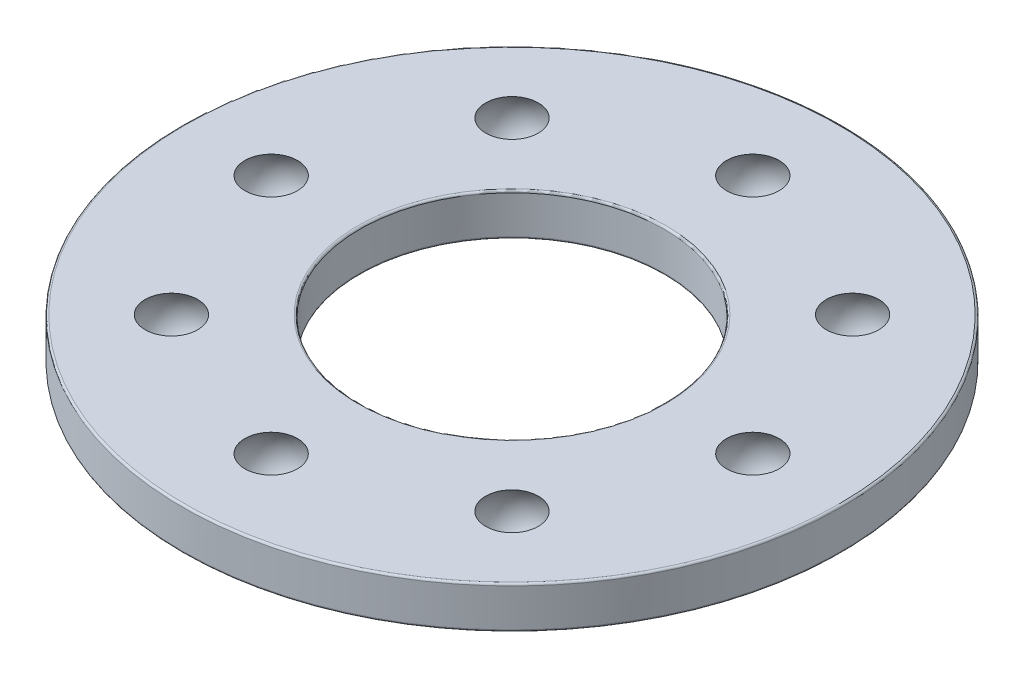
ISO-10303-21;
HEADER;
FILE_DESCRIPTION(('STEP AP214'),'2;1');
FILE_NAME('part.step','',(''),(''),'','','');
FILE_SCHEMA(('AUTOMOTIVE_DESIGN { 1 0 10303 214 1 1 1 1 }'));
ENDSEC;
DATA;
#1=APPLICATION_CONTEXT('core data for automotive mechanical design processes');
#2=APPLICATION_PROTOCOL_DEFINITION('international standard','automotive_design',2000,#1);
#3=PRODUCT_CONTEXT('',#1,'mechanical');
#4=PRODUCT('Part','Part','',(#3));
#5=PRODUCT_RELATED_PRODUCT_CATEGORY('part','',(#4));
#6=PRODUCT_DEFINITION_FORMATION('','',#4);
#7=PRODUCT_DEFINITION_CONTEXT('part definition',#1,'design');
#8=PRODUCT_DEFINITION('design','',#6,#7);
#9=PRODUCT_DEFINITION_SHAPE('','',#8);
#10=(LENGTH_UNIT() NAMED_UNIT(*) SI_UNIT(.MILLI.,.METRE.));
#11=(NAMED_UNIT(*) PLANE_ANGLE_UNIT() SI_UNIT($,.RADIAN.));
#12=(NAMED_UNIT(*) SI_UNIT($,.STERADIAN.) SOLID_ANGLE_UNIT());
#13=UNCERTAINTY_MEASURE_WITH_UNIT(LENGTH_MEASURE(1.E-05),#10,'distance_accuracy_value','');
#14=(GEOMETRIC_REPRESENTATION_CONTEXT(3) GLOBAL_UNCERTAINTY_ASSIGNED_CONTEXT((#13)) GLOBAL_UNIT_ASSIGNED_CONTEXT((#10,
#11,#12)) REPRESENTATION_CONTEXT('',''));
#15=CARTESIAN_POINT('',(0.,0.,0.));
#16=DIRECTION('',(0.,0.,1.));
#17=DIRECTION('',(1.,0.,0.));
#18=AXIS2_PLACEMENT_3D('',#15,#16,#17);
#19=CARTESIAN_POINT('',(0.,-0.595566500000005,0.));
#20=DIRECTION('',(0.,1.,0.));
#21=DIRECTION('',(0.,0.,1.));
#22=AXIS2_PLACEMENT_3D('',#19,#20,#21);
#23=TOROIDAL_SURFACE('',#22,4.825746,0.0632460000000001);
#24=CARTESIAN_POINT('',(0.,-0.595566500000005,0.));
#25=DIRECTION('',(0.,-1.,0.));
#26=DIRECTION('',(0.,0.,-1.));
#27=AXIS2_PLACEMENT_3D('',#24,#25,#26);
#28=CIRCLE('',#27,4.7625);
#29=CARTESIAN_POINT('',(0.,-0.595566500000005,-4.7625));
#30=VERTEX_POINT('',#29);
#31=EDGE_CURVE('E31',#30,#30,#28,.F.);
#32=ORIENTED_EDGE('',*,*,#31,.T.);
#33=EDGE_LOOP('',(#32));
#34=FACE_BOUND('',#33,.T.);
#35=CARTESIAN_POINT('',(0.,-0.658812500000005,0.));
#36=DIRECTION('',(0.,1.,0.));
#37=DIRECTION('',(0.,0.,1.));
#38=AXIS2_PLACEMENT_3D('',#35,#36,#37);
#39=CIRCLE('',#38,4.825746);
#40=CARTESIAN_POINT('',(0.,-0.658812500000005,4.825746));
#41=VERTEX_POINT('',#40);
#42=EDGE_CURVE('E19',#41,#41,#39,.T.);
#43=ORIENTED_EDGE('',*,*,#42,.F.);
#44=EDGE_LOOP('',(#43));
#45=FACE_BOUND('',#44,.T.);
#46=ADVANCED_FACE('F15',(#34,#45),#23,.T.);
#47=CARTESIAN_POINT('',(0.,-0.595566500000005,0.));
#48=DIRECTION('',(0.,1.,0.));
#49=DIRECTION('',(0.,0.,1.));
#50=AXIS2_PLACEMENT_3D('',#47,#48,#49);
#51=TOROIDAL_SURFACE('',#50,10.255504,0.0632459999999997);
#52=CARTESIAN_POINT('',(0.,-0.595566500000005,0.));
#53=DIRECTION('',(0.,-1.,0.));
#54=DIRECTION('',(0.,0.,-1.));
#55=AXIS2_PLACEMENT_3D('',#52,#53,#54);
#56=CIRCLE('',#55,10.31875);
#57=CARTESIAN_POINT('',(0.,-0.595566500000005,-10.31875));
#58=VERTEX_POINT('',#57);
#59=EDGE_CURVE('E82',#58,#58,#56,.F.);
#60=ORIENTED_EDGE('',*,*,#59,.F.);
#61=EDGE_LOOP('',(#60));
#62=FACE_BOUND('',#61,.T.);
#63=CARTESIAN_POINT('',(0.,-0.658812500000004,0.));
#64=DIRECTION('',(0.,1.,0.));
#65=DIRECTION('',(0.,0.,1.));
#66=AXIS2_PLACEMENT_3D('',#63,#64,#65);
#67=CIRCLE('',#66,10.255504);
#68=CARTESIAN_POINT('',(0.,-0.658812500000004,10.255504));
#69=VERTEX_POINT('',#68);
#70=EDGE_CURVE('E83',#69,#69,#67,.F.);
#71=ORIENTED_EDGE('',*,*,#70,.F.);
#72=EDGE_LOOP('',(#71));
#73=FACE_BOUND('',#72,.T.);
#74=ADVANCED_FACE('F95',(#62,#73),#51,.T.);
#75=CARTESIAN_POINT('',(0.,-0.658812500000004,10.31875));
#76=DIRECTION('',(0.,-1.,0.));
#77=DIRECTION('',(0.,0.,-1.));
#78=AXIS2_PLACEMENT_3D('',#75,#76,#77);
#79=PLANE('',#78);
#80=ORIENTED_EDGE('',*,*,#70,.T.);
#81=EDGE_LOOP('',(#80));
#82=FACE_BOUND('',#81,.T.);
#83=ORIENTED_EDGE('',*,*,#42,.T.);
#84=EDGE_LOOP('',(#83));
#85=FACE_BOUND('',#84,.T.);
#86=CARTESIAN_POINT('',(-5.33202707188475,-0.658812500000004,5.33202707188488));
#87=DIRECTION('',(0.,-1.,0.));
#88=DIRECTION('',(0.,0.,-1.));
#89=AXIS2_PLACEMENT_3D('',#86,#87,#88);
#90=CIRCLE('',#89,0.822856548763965);
#91=CARTESIAN_POINT('',(-5.33202707188475,-0.658812500000004,4.50917052312091));
#92=VERTEX_POINT('',#91);
#93=EDGE_CURVE('E58',#92,#92,#90,.F.);
#94=ORIENTED_EDGE('',*,*,#93,.T.);
#95=EDGE_LOOP('',(#94));
#96=FACE_BOUND('',#95,.T.);
#97=CARTESIAN_POINT('',(-7.54062500000001,-0.658812500000004,0.));
#98=DIRECTION('',(0.,-1.,0.));
#99=DIRECTION('',(0.,0.,-1.));
#100=AXIS2_PLACEMENT_3D('',#97,#98,#99);
#101=CIRCLE('',#100,0.822856548763967);
#102=CARTESIAN_POINT('',(-7.54062500000001,-0.658812500000004,-0.822856548763888));
#103=VERTEX_POINT('',#102);
#104=EDGE_CURVE('E62',#103,#103,#101,.F.);
#105=ORIENTED_EDGE('',*,*,#104,.T.);
#106=EDGE_LOOP('',(#105));
#107=FACE_BOUND('',#106,.T.);
#108=CARTESIAN_POINT('',(-5.33202707188486,-0.658812500000004,-5.33202707188477));
#109=DIRECTION('',(0.,-1.,0.));
#110=DIRECTION('',(0.,0.,-1.));
#111=AXIS2_PLACEMENT_3D('',#108,#109,#110);
#112=CIRCLE('',#111,0.822856548763966);
#113=CARTESIAN_POINT('',(-5.33202707188486,-0.658812500000004,-6.15488362064873));
#114=VERTEX_POINT('',#113);
#115=EDGE_CURVE('E65',#114,#114,#112,.F.);
#116=ORIENTED_EDGE('',*,*,#115,.T.);
#117=EDGE_LOOP('',(#116));
#118=FACE_BOUND('',#117,.T.);
#119=CARTESIAN_POINT('',(0.,-0.658812500000004,-7.54062500000001));
#120=DIRECTION('',(0.,-1.,0.));
#121=DIRECTION('',(0.,0.,-1.));
#122=AXIS2_PLACEMENT_3D('',#119,#120,#121);
#123=CIRCLE('',#122,0.822856548763966);
#124=CARTESIAN_POINT('',(0.,-0.658812500000004,-8.36348154876397));
#125=VERTEX_POINT('',#124);
#126=EDGE_CURVE('E68',#125,#125,#123,.F.);
#127=ORIENTED_EDGE('',*,*,#126,.T.);
#128=EDGE_LOOP('',(#127));
#129=FACE_BOUND('',#128,.T.);
#130=CARTESIAN_POINT('',(5.33202707188478,-0.658812500000004,-5.33202707188484));
#131=DIRECTION('',(0.,-1.,0.));
#132=DIRECTION('',(0.,0.,-1.));
#133=AXIS2_PLACEMENT_3D('',#130,#131,#132);
#134=CIRCLE('',#133,0.822856548763966);
#135=CARTESIAN_POINT('',(5.33202707188478,-0.658812500000004,-6.15488362064881));
#136=VERTEX_POINT('',#135);
#137=EDGE_CURVE('E71',#136,#136,#134,.F.);
#138=ORIENTED_EDGE('',*,*,#137,.T.);
#139=EDGE_LOOP('',(#138));
#140=FACE_BOUND('',#139,.T.);
#141=CARTESIAN_POINT('',(7.54062500000001,-0.658812500000004,0.));
#142=DIRECTION('',(0.,-1.,0.));
#143=DIRECTION('',(0.,0.,-1.));
#144=AXIS2_PLACEMENT_3D('',#141,#142,#143);
#145=CIRCLE('',#144,0.822856548763967);
#146=CARTESIAN_POINT('',(7.54062500000001,-0.658812500000004,-0.822856548763993));
#147=VERTEX_POINT('',#146);
#148=EDGE_CURVE('E74',#147,#147,#145,.F.);
#149=ORIENTED_EDGE('',*,*,#148,.T.);
#150=EDGE_LOOP('',(#149));
#151=FACE_BOUND('',#150,.T.);
#152=CARTESIAN_POINT('',(5.33202707188482,-0.658812500000004,5.3320270718848));
#153=DIRECTION('',(0.,-1.,0.));
#154=DIRECTION('',(0.,0.,-1.));
#155=AXIS2_PLACEMENT_3D('',#152,#153,#154);
#156=CIRCLE('',#155,0.822856548763966);
#157=CARTESIAN_POINT('',(5.33202707188482,-0.658812500000004,4.50917052312084));
#158=VERTEX_POINT('',#157);
#159=EDGE_CURVE('E77',#158,#158,#156,.F.);
#160=ORIENTED_EDGE('',*,*,#159,.T.);
#161=EDGE_LOOP('',(#160));
#162=FACE_BOUND('',#161,.T.);
#163=CARTESIAN_POINT('',(0.,-0.658812500000004,7.54062500000001));
#164=DIRECTION('',(0.,-1.,0.));
#165=DIRECTION('',(0.,0.,-1.));
#166=AXIS2_PLACEMENT_3D('',#163,#164,#165);
#167=CIRCLE('',#166,0.822856548763966);
#168=CARTESIAN_POINT('',(0.,-0.658812500000004,6.71776845123604));
#169=VERTEX_POINT('',#168);
#170=EDGE_CURVE('E80',#169,#169,#167,.F.);
#171=ORIENTED_EDGE('',*,*,#170,.T.);
#172=EDGE_LOOP('',(#171));
#173=FACE_BOUND('',#172,.T.);
#174=ADVANCED_FACE('F91',(#82,#85,#96,#107,#118,#129,#140,#151,#162,#173),#79,.T.);
#175=CARTESIAN_POINT('',(0.,-3.1623,0.));
#176=DIRECTION('',(0.,-1.,0.));
#177=DIRECTION('',(0.,0.,-1.));
#178=AXIS2_PLACEMENT_3D('',#175,#176,#177);
#179=CYLINDRICAL_SURFACE('',#178,4.7625);
#180=ORIENTED_EDGE('',*,*,#31,.F.);
#181=EDGE_LOOP('',(#180));
#182=FACE_BOUND('',#181,.T.);
#183=CARTESIAN_POINT('',(0.,0.595566499999995,0.));
#184=DIRECTION('',(0.,-1.,0.));
#185=DIRECTION('',(0.,0.,-1.));
#186=AXIS2_PLACEMENT_3D('',#183,#184,#185);
#187=CIRCLE('',#186,4.7625);
#188=CARTESIAN_POINT('',(0.,0.595566499999995,-4.7625));
#189=VERTEX_POINT('',#188);
#190=EDGE_CURVE('E61',#189,#189,#187,.T.);
#191=ORIENTED_EDGE('',*,*,#190,.F.);
#192=EDGE_LOOP('',(#191));
#193=FACE_BOUND('',#192,.T.);
#194=ADVANCED_FACE('F119',(#182,#193),#179,.F.);
#195=CARTESIAN_POINT('',(0.,-3.1623,0.));
#196=DIRECTION('',(0.,-1.,0.));
#197=DIRECTION('',(0.,0.,-1.));
#198=AXIS2_PLACEMENT_3D('',#195,#196,#197);
#199=CYLINDRICAL_SURFACE('',#198,10.31875);
#200=ORIENTED_EDGE('',*,*,#59,.T.);
#201=EDGE_LOOP('',(#200));
#202=FACE_BOUND('',#201,.T.);
#203=CARTESIAN_POINT('',(0.,0.595566499999996,0.));
#204=DIRECTION('',(0.,1.,0.));
#205=DIRECTION('',(-1.,0.,0.));
#206=AXIS2_PLACEMENT_3D('',#203,#204,#205);
#207=CIRCLE('',#206,10.31875);
#208=CARTESIAN_POINT('',(-10.31875,0.595566499999996,0.));
#209=VERTEX_POINT('',#208);
#210=EDGE_CURVE('E57',#209,#209,#207,.T.);
#211=ORIENTED_EDGE('',*,*,#210,.F.);
#212=EDGE_LOOP('',(#211));
#213=FACE_BOUND('',#212,.T.);
#214=ADVANCED_FACE('F115',(#202,#213),#199,.T.);
#215=CARTESIAN_POINT('',(0.,0.,7.54062500000001));
#216=DIRECTION('',(1.,0.,0.));
#217=DIRECTION('',(0.,1.,0.));
#218=AXIS2_PLACEMENT_3D('',#215,#216,#217);
#219=SPHERICAL_SURFACE('',#218,1.0541);
#220=CARTESIAN_POINT('',(0.,0.,7.54062500000001));
#221=DIRECTION('',(0.,1.,0.));
#222=DIRECTION('',(0.,0.,1.));
#223=AXIS2_PLACEMENT_3D('',#220,#221,#222);
#224=SPHERICAL_SURFACE('',#223,1.0541);
#225=CARTESIAN_POINT('',(0.,0.658812499999996,7.54062500000001));
#226=DIRECTION('',(0.,1.,0.));
#227=DIRECTION('',(0.,0.,1.));
#228=AXIS2_PLACEMENT_3D('',#225,#226,#227);
#229=CIRCLE('',#228,0.822856548763973);
#230=CARTESIAN_POINT('',(0.,0.658812499999996,8.36348154876398));
#231=VERTEX_POINT('',#230);
#232=EDGE_CURVE('E54',#231,#231,#229,.F.);
#233=ORIENTED_EDGE('',*,*,#232,.F.);
#234=EDGE_LOOP('',(#233));
#235=FACE_BOUND('',#234,.T.);
#236=ORIENTED_EDGE('',*,*,#170,.F.);
#237=EDGE_LOOP('',(#236));
#238=FACE_BOUND('',#237,.T.);
#239=ADVANCED_FACE('F118',(#235,#238),#224,.F.);
#240=CARTESIAN_POINT('',(5.33202707188482,0.,5.3320270718848));
#241=DIRECTION('',(1.,0.,0.));
#242=DIRECTION('',(0.,1.,0.));
#243=AXIS2_PLACEMENT_3D('',#240,#241,#242);
#244=SPHERICAL_SURFACE('',#243,1.0541);
#245=CARTESIAN_POINT('',(5.33202707188482,0.,5.3320270718848));
#246=DIRECTION('',(0.,1.,0.));
#247=DIRECTION('',(0.,0.,1.));
#248=AXIS2_PLACEMENT_3D('',#245,#246,#247);
#249=SPHERICAL_SURFACE('',#248,1.0541);
#250=CARTESIAN_POINT('',(5.33202707188482,0.658812499999996,5.3320270718848));
#251=DIRECTION('',(0.,1.,0.));
#252=DIRECTION('',(0.,0.,1.));
#253=AXIS2_PLACEMENT_3D('',#250,#251,#252);
#254=CIRCLE('',#253,0.822856548763973);
#255=CARTESIAN_POINT('',(5.33202707188482,0.658812499999996,6.15488362064878));
#256=VERTEX_POINT('',#255);
#257=EDGE_CURVE('E51',#256,#256,#254,.F.);
#258=ORIENTED_EDGE('',*,*,#257,.F.);
#259=EDGE_LOOP('',(#258));
#260=FACE_BOUND('',#259,.T.);
#261=ORIENTED_EDGE('',*,*,#159,.F.);
#262=EDGE_LOOP('',(#261));
#263=FACE_BOUND('',#262,.T.);
#264=ADVANCED_FACE('F144',(#260,#263),#249,.F.);
#265=CARTESIAN_POINT('',(7.54062500000001,0.,0.));
#266=DIRECTION('',(1.,0.,0.));
#267=DIRECTION('',(0.,1.,0.));
#268=AXIS2_PLACEMENT_3D('',#265,#266,#267);
#269=SPHERICAL_SURFACE('',#268,1.0541);
#270=CARTESIAN_POINT('',(7.54062500000001,0.,0.));
#271=DIRECTION('',(0.,1.,0.));
#272=DIRECTION('',(0.,0.,1.));
#273=AXIS2_PLACEMENT_3D('',#270,#271,#272);
#274=SPHERICAL_SURFACE('',#273,1.0541);
#275=CARTESIAN_POINT('',(7.54062500000001,0.658812499999996,0.));
#276=DIRECTION('',(0.,1.,0.));
#277=DIRECTION('',(0.,0.,1.));
#278=AXIS2_PLACEMENT_3D('',#275,#276,#277);
#279=CIRCLE('',#278,0.822856548763974);
#280=CARTESIAN_POINT('',(7.54062500000001,0.658812499999996,0.822856548763947));
#281=VERTEX_POINT('',#280);
#282=EDGE_CURVE('E48',#281,#281,#279,.F.);
#283=ORIENTED_EDGE('',*,*,#282,.F.);
#284=EDGE_LOOP('',(#283));
#285=FACE_BOUND('',#284,.T.);
#286=ORIENTED_EDGE('',*,*,#148,.F.);
#287=EDGE_LOOP('',(#286));
#288=FACE_BOUND('',#287,.T.);
#289=ADVANCED_FACE('F152',(#285,#288),#274,.F.);
#290=CARTESIAN_POINT('',(5.33202707188478,0.,-5.33202707188484));
#291=DIRECTION('',(1.,0.,0.));
#292=DIRECTION('',(0.,-1.,0.));
#293=AXIS2_PLACEMENT_3D('',#290,#291,#292);
#294=SPHERICAL_SURFACE('',#293,1.0541);
#295=CARTESIAN_POINT('',(5.33202707188478,0.,-5.33202707188484));
#296=DIRECTION('',(0.,-1.,0.));
#297=DIRECTION('',(0.,0.,-1.));
#298=AXIS2_PLACEMENT_3D('',#295,#296,#297);
#299=SPHERICAL_SURFACE('',#298,1.0541);
#300=ORIENTED_EDGE('',*,*,#137,.F.);
#301=EDGE_LOOP('',(#300));
#302=FACE_BOUND('',#301,.T.);
#303=CARTESIAN_POINT('',(5.33202707188478,0.658812499999996,-5.33202707188484));
#304=DIRECTION('',(0.,1.,0.));
#305=DIRECTION('',(0.,0.,1.));
#306=AXIS2_PLACEMENT_3D('',#303,#304,#305);
#307=CIRCLE('',#306,0.822856548763973);
#308=CARTESIAN_POINT('',(5.33202707188478,0.658812499999996,-4.50917052312087));
#309=VERTEX_POINT('',#308);
#310=EDGE_CURVE('E45',#309,#309,#307,.F.);
#311=ORIENTED_EDGE('',*,*,#310,.F.);
#312=EDGE_LOOP('',(#311));
#313=FACE_BOUND('',#312,.T.);
#314=ADVANCED_FACE('F160',(#302,#313),#299,.F.);
#315=CARTESIAN_POINT('',(0.,0.,-7.54062500000001));
#316=DIRECTION('',(1.,0.,0.));
#317=DIRECTION('',(0.,-1.,0.));
#318=AXIS2_PLACEMENT_3D('',#315,#316,#317);
#319=SPHERICAL_SURFACE('',#318,1.0541);
#320=CARTESIAN_POINT('',(0.,0.,-7.54062500000001));
#321=DIRECTION('',(0.,-1.,0.));
#322=DIRECTION('',(0.,0.,-1.));
#323=AXIS2_PLACEMENT_3D('',#320,#321,#322);
#324=SPHERICAL_SURFACE('',#323,1.0541);
#325=ORIENTED_EDGE('',*,*,#126,.F.);
#326=EDGE_LOOP('',(#325));
#327=FACE_BOUND('',#326,.T.);
#328=CARTESIAN_POINT('',(0.,0.658812499999996,-7.54062500000001));
#329=DIRECTION('',(0.,1.,0.));
#330=DIRECTION('',(0.,0.,1.));
#331=AXIS2_PLACEMENT_3D('',#328,#329,#330);
#332=CIRCLE('',#331,0.822856548763972);
#333=CARTESIAN_POINT('',(0.,0.658812499999996,-6.71776845123603));
#334=VERTEX_POINT('',#333);
#335=EDGE_CURVE('E42',#334,#334,#332,.F.);
#336=ORIENTED_EDGE('',*,*,#335,.F.);
#337=EDGE_LOOP('',(#336));
#338=FACE_BOUND('',#337,.T.);
#339=ADVANCED_FACE('F168',(#327,#338),#324,.F.);
#340=CARTESIAN_POINT('',(-5.33202707188486,0.,-5.33202707188477));
#341=DIRECTION('',(1.,0.,0.));
#342=DIRECTION('',(0.,-1.,0.));
#343=AXIS2_PLACEMENT_3D('',#340,#341,#342);
#344=SPHERICAL_SURFACE('',#343,1.0541);
#345=CARTESIAN_POINT('',(-5.33202707188486,0.,-5.33202707188477));
#346=DIRECTION('',(0.,-1.,0.));
#347=DIRECTION('',(0.,0.,-1.));
#348=AXIS2_PLACEMENT_3D('',#345,#346,#347);
#349=SPHERICAL_SURFACE('',#348,1.0541);
#350=ORIENTED_EDGE('',*,*,#115,.F.);
#351=EDGE_LOOP('',(#350));
#352=FACE_BOUND('',#351,.T.);
#353=CARTESIAN_POINT('',(-5.33202707188486,0.658812499999996,-5.33202707188477));
#354=DIRECTION('',(0.,1.,0.));
#355=DIRECTION('',(0.,0.,1.));
#356=AXIS2_PLACEMENT_3D('',#353,#354,#355);
#357=CIRCLE('',#356,0.822856548763973);
#358=CARTESIAN_POINT('',(-5.33202707188486,0.658812499999996,-4.50917052312079));
#359=VERTEX_POINT('',#358);
#360=EDGE_CURVE('E39',#359,#359,#357,.F.);
#361=ORIENTED_EDGE('',*,*,#360,.F.);
#362=EDGE_LOOP('',(#361));
#363=FACE_BOUND('',#362,.T.);
#364=ADVANCED_FACE('F176',(#352,#363),#349,.F.);
#365=CARTESIAN_POINT('',(-7.54062500000001,0.,0.));
#366=DIRECTION('',(1.,0.,0.));
#367=DIRECTION('',(0.,-1.,0.));
#368=AXIS2_PLACEMENT_3D('',#365,#366,#367);
#369=SPHERICAL_SURFACE('',#368,1.0541);
#370=CARTESIAN_POINT('',(-7.54062500000001,0.,0.));
#371=DIRECTION('',(0.,-1.,0.));
#372=DIRECTION('',(0.,0.,-1.));
#373=AXIS2_PLACEMENT_3D('',#370,#371,#372);
#374=SPHERICAL_SURFACE('',#373,1.0541);
#375=ORIENTED_EDGE('',*,*,#104,.F.);
#376=EDGE_LOOP('',(#375));
#377=FACE_BOUND('',#376,.T.);
#378=CARTESIAN_POINT('',(-7.54062500000001,0.658812499999996,0.));
#379=DIRECTION('',(0.,1.,0.));
#380=DIRECTION('',(0.,0.,1.));
#381=AXIS2_PLACEMENT_3D('',#378,#379,#380);
#382=CIRCLE('',#381,0.822856548763973);
#383=CARTESIAN_POINT('',(-7.54062500000001,0.658812499999996,0.822856548764052));
#384=VERTEX_POINT('',#383);
#385=EDGE_CURVE('E36',#384,#384,#382,.F.);
#386=ORIENTED_EDGE('',*,*,#385,.F.);
#387=EDGE_LOOP('',(#386));
#388=FACE_BOUND('',#387,.T.);
#389=ADVANCED_FACE('F184',(#377,#388),#374,.F.);
#390=CARTESIAN_POINT('',(-5.33202707188475,0.,5.33202707188488));
#391=DIRECTION('',(1.,0.,0.));
#392=DIRECTION('',(0.,1.,0.));
#393=AXIS2_PLACEMENT_3D('',#390,#391,#392);
#394=SPHERICAL_SURFACE('',#393,1.0541);
#395=CARTESIAN_POINT('',(-5.33202707188475,0.,5.33202707188488));
#396=DIRECTION('',(0.,1.,0.));
#397=DIRECTION('',(0.,0.,1.));
#398=AXIS2_PLACEMENT_3D('',#395,#396,#397);
#399=SPHERICAL_SURFACE('',#398,1.0541);
#400=CARTESIAN_POINT('',(-5.33202707188475,0.658812499999996,5.33202707188488));
#401=DIRECTION('',(0.,1.,0.));
#402=DIRECTION('',(0.,0.,1.));
#403=AXIS2_PLACEMENT_3D('',#400,#401,#402);
#404=CIRCLE('',#403,0.822856548763972);
#405=CARTESIAN_POINT('',(-5.33202707188475,0.658812499999996,6.15488362064885));
#406=VERTEX_POINT('',#405);
#407=EDGE_CURVE('E28',#406,#406,#404,.F.);
#408=ORIENTED_EDGE('',*,*,#407,.F.);
#409=EDGE_LOOP('',(#408));
#410=FACE_BOUND('',#409,.T.);
#411=ORIENTED_EDGE('',*,*,#93,.F.);
#412=EDGE_LOOP('',(#411));
#413=FACE_BOUND('',#412,.T.);
#414=ADVANCED_FACE('F192',(#410,#413),#399,.F.);
#415=CARTESIAN_POINT('',(0.,0.595566499999995,0.));
#416=DIRECTION('',(0.,-1.,0.));
#417=DIRECTION('',(0.,0.,-1.));
#418=AXIS2_PLACEMENT_3D('',#415,#416,#417);
#419=TOROIDAL_SURFACE('',#418,4.825746,0.0632460000000002);
#420=ORIENTED_EDGE('',*,*,#190,.T.);
#421=EDGE_LOOP('',(#420));
#422=FACE_BOUND('',#421,.T.);
#423=CARTESIAN_POINT('',(0.,0.658812499999996,0.));
#424=DIRECTION('',(0.,-1.,0.));
#425=DIRECTION('',(1.,0.,0.));
#426=AXIS2_PLACEMENT_3D('',#423,#424,#425);
#427=CIRCLE('',#426,4.825746);
#428=CARTESIAN_POINT('',(4.825746,0.658812499999996,0.));
#429=VERTEX_POINT('',#428);
#430=EDGE_CURVE('E23',#429,#429,#427,.T.);
#431=ORIENTED_EDGE('',*,*,#430,.F.);
#432=EDGE_LOOP('',(#431));
#433=FACE_BOUND('',#432,.T.);
#434=ADVANCED_FACE('F111',(#422,#433),#419,.T.);
#435=CARTESIAN_POINT('',(0.,0.595566499999996,0.));
#436=DIRECTION('',(0.,-1.,0.));
#437=DIRECTION('',(1.,0.,0.));
#438=AXIS2_PLACEMENT_3D('',#435,#436,#437);
#439=TOROIDAL_SURFACE('',#438,10.255504,0.0632459999999997);
#440=ORIENTED_EDGE('',*,*,#210,.T.);
#441=EDGE_LOOP('',(#440));
#442=FACE_BOUND('',#441,.T.);
#443=CARTESIAN_POINT('',(0.,0.658812499999995,0.));
#444=DIRECTION('',(0.,-1.,0.));
#445=DIRECTION('',(1.,0.,0.));
#446=AXIS2_PLACEMENT_3D('',#443,#444,#445);
#447=CIRCLE('',#446,10.255504);
#448=CARTESIAN_POINT('',(10.255504,0.658812499999995,0.));
#449=VERTEX_POINT('',#448);
#450=EDGE_CURVE('E10',#449,#449,#447,.F.);
#451=ORIENTED_EDGE('',*,*,#450,.F.);
#452=EDGE_LOOP('',(#451));
#453=FACE_BOUND('',#452,.T.);
#454=ADVANCED_FACE('F17',(#442,#453),#439,.T.);
#455=CARTESIAN_POINT('',(0.,0.658812499999996,10.31875));
#456=DIRECTION('',(0.,1.,0.));
#457=DIRECTION('',(0.,0.,1.));
#458=AXIS2_PLACEMENT_3D('',#455,#456,#457);
#459=PLANE('',#458);
#460=ORIENTED_EDGE('',*,*,#450,.T.);
#461=EDGE_LOOP('',(#460));
#462=FACE_BOUND('',#461,.T.);
#463=ORIENTED_EDGE('',*,*,#430,.T.);
#464=EDGE_LOOP('',(#463));
#465=FACE_BOUND('',#464,.T.);
#466=ORIENTED_EDGE('',*,*,#407,.T.);
#467=EDGE_LOOP('',(#466));
#468=FACE_BOUND('',#467,.T.);
#469=ORIENTED_EDGE('',*,*,#385,.T.);
#470=EDGE_LOOP('',(#469));
#471=FACE_BOUND('',#470,.T.);
#472=ORIENTED_EDGE('',*,*,#360,.T.);
#473=EDGE_LOOP('',(#472));
#474=FACE_BOUND('',#473,.T.);
#475=ORIENTED_EDGE('',*,*,#335,.T.);
#476=EDGE_LOOP('',(#475));
#477=FACE_BOUND('',#476,.T.);
#478=ORIENTED_EDGE('',*,*,#310,.T.);
#479=EDGE_LOOP('',(#478));
#480=FACE_BOUND('',#479,.T.);
#481=ORIENTED_EDGE('',*,*,#282,.T.);
#482=EDGE_LOOP('',(#481));
#483=FACE_BOUND('',#482,.T.);
#484=ORIENTED_EDGE('',*,*,#257,.T.);
#485=EDGE_LOOP('',(#484));
#486=FACE_BOUND('',#485,.T.);
#487=ORIENTED_EDGE('',*,*,#232,.T.);
#488=EDGE_LOOP('',(#487));
#489=FACE_BOUND('',#488,.T.);
#490=ADVANCED_FACE('F105',(#462,#465,#468,#471,#474,#477,#480,#483,#486,#489),#459,.T.);
#491=CLOSED_SHELL('',(#46,#74,#174,#194,#214,#239,#264,#289,#314,#339,#364,#389,#414,#434,#454,#490));
#492=MANIFOLD_SOLID_BREP('B1',#491);
#493=ADVANCED_BREP_SHAPE_REPRESENTATION('',(#18,#492),#14);
#494=SHAPE_DEFINITION_REPRESENTATION(#9,#493);
ENDSEC;
END-ISO-10303-21;
